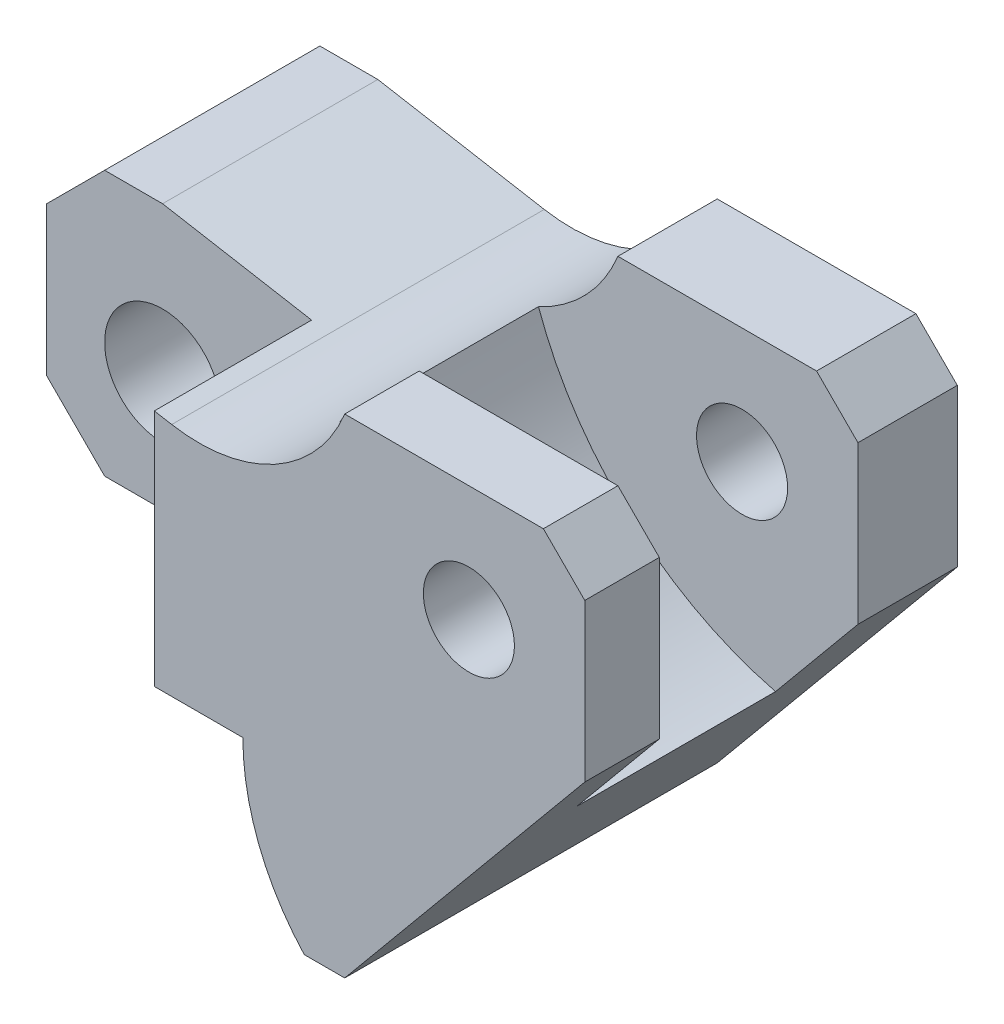
ISO-10303-21;
HEADER;
FILE_DESCRIPTION(('STEP AP214'),'2;1');
FILE_NAME('part.step','',(''),(''),'','','');
FILE_SCHEMA(('AUTOMOTIVE_DESIGN { 1 0 10303 214 1 1 1 1 }'));
ENDSEC;
DATA;
#1=APPLICATION_CONTEXT('core data for automotive mechanical design processes');
#2=APPLICATION_PROTOCOL_DEFINITION('international standard','automotive_design',2000,#1);
#3=PRODUCT_CONTEXT('',#1,'mechanical');
#4=PRODUCT('Part','Part','',(#3));
#5=PRODUCT_RELATED_PRODUCT_CATEGORY('part','',(#4));
#6=PRODUCT_DEFINITION_FORMATION('','',#4);
#7=PRODUCT_DEFINITION_CONTEXT('part definition',#1,'design');
#8=PRODUCT_DEFINITION('design','',#6,#7);
#9=PRODUCT_DEFINITION_SHAPE('','',#8);
#10=(LENGTH_UNIT() NAMED_UNIT(*) SI_UNIT(.MILLI.,.METRE.));
#11=(NAMED_UNIT(*) PLANE_ANGLE_UNIT() SI_UNIT($,.RADIAN.));
#12=(NAMED_UNIT(*) SI_UNIT($,.STERADIAN.) SOLID_ANGLE_UNIT());
#13=UNCERTAINTY_MEASURE_WITH_UNIT(LENGTH_MEASURE(1.E-05),#10,'distance_accuracy_value','');
#14=(GEOMETRIC_REPRESENTATION_CONTEXT(3) GLOBAL_UNCERTAINTY_ASSIGNED_CONTEXT((#13)) GLOBAL_UNIT_ASSIGNED_CONTEXT((#10,
#11,#12)) REPRESENTATION_CONTEXT('',''));
#15=CARTESIAN_POINT('',(0.,0.,0.));
#16=DIRECTION('',(0.,0.,1.));
#17=DIRECTION('',(1.,0.,0.));
#18=AXIS2_PLACEMENT_3D('',#15,#16,#17);
#19=CARTESIAN_POINT('',(52.,35.,0.));
#20=DIRECTION('',(0.707106781186544,0.707106781186551,0.));
#21=DIRECTION('',(0.,0.,-1.));
#22=AXIS2_PLACEMENT_3D('',#19,#20,#21);
#23=PLANE('',#22);
#24=DIRECTION('',(0.,0.,-1.));
#25=VECTOR('',#24,1.);
#26=CARTESIAN_POINT('',(47.,40.,0.));
#27=LINE('',#26,#25);
#28=CARTESIAN_POINT('',(47.,40.,12.));
#29=VERTEX_POINT('',#28);
#30=CARTESIAN_POINT('',(47.,40.,0.));
#31=VERTEX_POINT('',#30);
#32=EDGE_CURVE('E304',#29,#31,#27,.T.);
#33=ORIENTED_EDGE('',*,*,#32,.F.);
#34=DIRECTION('',(0.707106781186551,-0.707106781186544,0.));
#35=VECTOR('',#34,1.);
#36=CARTESIAN_POINT('',(52.,35.,12.));
#37=LINE('',#36,#35);
#38=CARTESIAN_POINT('',(52.,35.,12.));
#39=VERTEX_POINT('',#38);
#40=EDGE_CURVE('E352',#29,#39,#37,.T.);
#41=ORIENTED_EDGE('',*,*,#40,.T.);
#42=DIRECTION('',(0.,0.,1.));
#43=VECTOR('',#42,1.);
#44=CARTESIAN_POINT('',(52.,35.,45.));
#45=LINE('',#44,#43);
#46=CARTESIAN_POINT('',(52.,35.,0.));
#47=VERTEX_POINT('',#46);
#48=EDGE_CURVE('E299',#47,#39,#45,.T.);
#49=ORIENTED_EDGE('',*,*,#48,.F.);
#50=DIRECTION('',(0.707106781186551,-0.707106781186544,0.));
#51=VECTOR('',#50,1.);
#52=CARTESIAN_POINT('',(27.4999999999996,59.5000000000002,0.));
#53=LINE('',#52,#51);
#54=EDGE_CURVE('E308',#31,#47,#53,.T.);
#55=ORIENTED_EDGE('',*,*,#54,.F.);
#56=EDGE_LOOP('',(#33,#41,#49,#55));
#57=FACE_BOUND('',#56,.T.);
#58=ADVANCED_FACE('F39',(#57),#23,.T.);
#59=CARTESIAN_POINT('',(52.,40.,0.));
#60=DIRECTION('',(0.,-1.,0.));
#61=DIRECTION('',(0.,0.,-1.));
#62=AXIS2_PLACEMENT_3D('',#59,#60,#61);
#63=PLANE('',#62);
#64=DIRECTION('',(-1.,0.,0.));
#65=VECTOR('',#64,1.);
#66=CARTESIAN_POINT('',(52.,40.,12.));
#67=LINE('',#66,#65);
#68=CARTESIAN_POINT('',(23.,40.,12.));
#69=VERTEX_POINT('',#68);
#70=EDGE_CURVE('E191',#29,#69,#67,.T.);
#71=ORIENTED_EDGE('',*,*,#70,.F.);
#72=ORIENTED_EDGE('',*,*,#32,.T.);
#73=DIRECTION('',(-1.,0.,0.));
#74=VECTOR('',#73,1.);
#75=CARTESIAN_POINT('',(52.,40.,0.));
#76=LINE('',#75,#74);
#77=CARTESIAN_POINT('',(23.,40.,0.));
#78=VERTEX_POINT('',#77);
#79=EDGE_CURVE('E251',#31,#78,#76,.T.);
#80=ORIENTED_EDGE('',*,*,#79,.T.);
#81=DIRECTION('',(0.,0.,1.));
#82=VECTOR('',#81,1.);
#83=CARTESIAN_POINT('',(23.,40.,-0.0100000000000046));
#84=LINE('',#83,#82);
#85=EDGE_CURVE('E312',#78,#69,#84,.T.);
#86=ORIENTED_EDGE('',*,*,#85,.T.);
#87=EDGE_LOOP('',(#71,#72,#80,#86));
#88=FACE_BOUND('',#87,.T.);
#89=ADVANCED_FACE('F380',(#88),#63,.F.);
#90=CARTESIAN_POINT('',(52.,0.,0.));
#91=DIRECTION('',(1.,0.,0.));
#92=DIRECTION('',(0.,0.,-1.));
#93=AXIS2_PLACEMENT_3D('',#90,#91,#92);
#94=PLANE('',#93);
#95=ORIENTED_EDGE('',*,*,#48,.T.);
#96=DIRECTION('',(0.,-1.,0.));
#97=VECTOR('',#96,1.);
#98=CARTESIAN_POINT('',(52.,0.,12.));
#99=LINE('',#98,#97);
#100=CARTESIAN_POINT('',(52.,16.,12.));
#101=VERTEX_POINT('',#100);
#102=EDGE_CURVE('E346',#39,#101,#99,.T.);
#103=ORIENTED_EDGE('',*,*,#102,.T.);
#104=DIRECTION('',(0.,0.,1.));
#105=VECTOR('',#104,1.);
#106=CARTESIAN_POINT('',(52.,16.,0.));
#107=LINE('',#106,#105);
#108=CARTESIAN_POINT('',(52.,16.,0.));
#109=VERTEX_POINT('',#108);
#110=EDGE_CURVE('E341',#109,#101,#107,.T.);
#111=ORIENTED_EDGE('',*,*,#110,.F.);
#112=DIRECTION('',(0.,1.,0.));
#113=VECTOR('',#112,1.);
#114=CARTESIAN_POINT('',(52.,0.,0.));
#115=LINE('',#114,#113);
#116=EDGE_CURVE('E245',#109,#47,#115,.T.);
#117=ORIENTED_EDGE('',*,*,#116,.T.);
#118=EDGE_LOOP('',(#95,#103,#111,#117));
#119=FACE_BOUND('',#118,.T.);
#120=ADVANCED_FACE('F349',(#119),#94,.T.);
#121=CARTESIAN_POINT('',(52.,-19.,0.));
#122=DIRECTION('',(0.,-1.,0.));
#123=DIRECTION('',(0.,0.,-1.));
#124=AXIS2_PLACEMENT_3D('',#121,#122,#123);
#125=PLANE('',#124);
#126=DIRECTION('',(-1.,0.,0.));
#127=VECTOR('',#126,1.);
#128=CARTESIAN_POINT('',(52.,-19.,45.));
#129=LINE('',#128,#127);
#130=CARTESIAN_POINT('',(23.,-19.,45.));
#131=VERTEX_POINT('',#130);
#132=CARTESIAN_POINT('',(18.1134654255188,-19.,45.));
#133=VERTEX_POINT('',#132);
#134=EDGE_CURVE('E257',#131,#133,#129,.T.);
#135=ORIENTED_EDGE('',*,*,#134,.T.);
#136=DIRECTION('',(0.,0.,1.));
#137=VECTOR('',#136,1.);
#138=CARTESIAN_POINT('',(18.1134654255188,-19.,0.));
#139=LINE('',#138,#137);
#140=CARTESIAN_POINT('',(18.1134654255188,-19.,0.));
#141=VERTEX_POINT('',#140);
#142=EDGE_CURVE('E223',#141,#133,#139,.T.);
#143=ORIENTED_EDGE('',*,*,#142,.F.);
#144=DIRECTION('',(-1.,0.,0.));
#145=VECTOR('',#144,1.);
#146=CARTESIAN_POINT('',(52.,-19.,0.));
#147=LINE('',#146,#145);
#148=CARTESIAN_POINT('',(23.,-19.,0.));
#149=VERTEX_POINT('',#148);
#150=EDGE_CURVE('E254',#149,#141,#147,.T.);
#151=ORIENTED_EDGE('',*,*,#150,.F.);
#152=DIRECTION('',(0.,0.,1.));
#153=VECTOR('',#152,1.);
#154=CARTESIAN_POINT('',(23.,-19.,-7.00000000000001));
#155=LINE('',#154,#153);
#156=EDGE_CURVE('E231',#149,#131,#155,.T.);
#157=ORIENTED_EDGE('',*,*,#156,.T.);
#158=EDGE_LOOP('',(#135,#143,#151,#157));
#159=FACE_BOUND('',#158,.T.);
#160=ADVANCED_FACE('F496',(#159),#125,.T.);
#161=CARTESIAN_POINT('',(52.,0.,45.));
#162=DIRECTION('',(0.,0.,1.));
#163=DIRECTION('',(1.,0.,0.));
#164=AXIS2_PLACEMENT_3D('',#161,#162,#163);
#165=PLANE('',#164);
#166=CARTESIAN_POINT('',(38.,26.,45.));
#167=DIRECTION('',(0.,0.,1.));
#168=DIRECTION('',(1.,0.,0.));
#169=AXIS2_PLACEMENT_3D('',#166,#167,#168);
#170=CIRCLE('',#169,5.5);
#171=CARTESIAN_POINT('',(43.5,26.,45.));
#172=VERTEX_POINT('',#171);
#173=EDGE_CURVE('E433',#172,#172,#170,.T.);
#174=ORIENTED_EDGE('',*,*,#173,.F.);
#175=EDGE_LOOP('',(#174));
#176=FACE_BOUND('',#175,.T.);
#177=DIRECTION('',(0.984807753012208,-0.173648177666931,0.));
#178=VECTOR('',#177,1.);
#179=CARTESIAN_POINT('',(55.3615640207175,19.0643769161761,45.));
#180=LINE('',#179,#178);
#181=CARTESIAN_POINT('',(0.,28.8261143472476,45.));
#182=VERTEX_POINT('',#181);
#183=CARTESIAN_POINT('',(2.10404235201317,28.4551149120344,45.));
#184=VERTEX_POINT('',#183);
#185=EDGE_CURVE('E315',#182,#184,#180,.T.);
#186=ORIENTED_EDGE('',*,*,#185,.F.);
#187=DIRECTION('',(0.,1.,0.));
#188=VECTOR('',#187,1.);
#189=CARTESIAN_POINT('',(0.,0.,45.));
#190=LINE('',#189,#188);
#191=CARTESIAN_POINT('',(0.,0.,45.));
#192=VERTEX_POINT('',#191);
#193=EDGE_CURVE('E239',#192,#182,#190,.T.);
#194=ORIENTED_EDGE('',*,*,#193,.F.);
#195=DIRECTION('',(-1.,0.,0.));
#196=VECTOR('',#195,1.);
#197=CARTESIAN_POINT('',(0.,0.,45.));
#198=LINE('',#197,#196);
#199=CARTESIAN_POINT('',(10.6969696969697,-1.89158424479087E-13,45.));
#200=VERTEX_POINT('',#199);
#201=EDGE_CURVE('E213',#200,#192,#198,.T.);
#202=ORIENTED_EDGE('',*,*,#201,.F.);
#203=CARTESIAN_POINT('',(38.7428571428571,0.,45.));
#204=DIRECTION('',(0.,0.,1.));
#205=DIRECTION('',(1.,0.,0.));
#206=AXIS2_PLACEMENT_3D('',#203,#204,#205);
#207=CIRCLE('',#206,28.0458874458874);
#208=EDGE_CURVE('E210',#200,#133,#207,.T.);
#209=ORIENTED_EDGE('',*,*,#208,.T.);
#210=ORIENTED_EDGE('',*,*,#134,.F.);
#211=DIRECTION('',(-0.638017864750323,-0.770021560905562,0.));
#212=VECTOR('',#211,1.);
#213=CARTESIAN_POINT('',(52.,16.,45.));
#214=LINE('',#213,#212);
#215=CARTESIAN_POINT('',(52.,16.,45.));
#216=VERTEX_POINT('',#215);
#217=EDGE_CURVE('E225',#216,#131,#214,.T.);
#218=ORIENTED_EDGE('',*,*,#217,.F.);
#219=DIRECTION('',(0.,1.,0.));
#220=VECTOR('',#219,1.);
#221=CARTESIAN_POINT('',(52.,0.,45.));
#222=LINE('',#221,#220);
#223=CARTESIAN_POINT('',(52.,35.,45.));
#224=VERTEX_POINT('',#223);
#225=EDGE_CURVE('E242',#216,#224,#222,.T.);
#226=ORIENTED_EDGE('',*,*,#225,.T.);
#227=DIRECTION('',(-0.707106781186551,0.707106781186544,0.));
#228=VECTOR('',#227,1.);
#229=CARTESIAN_POINT('',(69.5,17.5000000000002,45.));
#230=LINE('',#229,#228);
#231=CARTESIAN_POINT('',(47.,40.,45.));
#232=VERTEX_POINT('',#231);
#233=EDGE_CURVE('E302',#224,#232,#230,.T.);
#234=ORIENTED_EDGE('',*,*,#233,.T.);
#235=DIRECTION('',(-1.,0.,0.));
#236=VECTOR('',#235,1.);
#237=CARTESIAN_POINT('',(52.,40.,45.));
#238=LINE('',#237,#236);
#239=CARTESIAN_POINT('',(23.,40.,45.));
#240=VERTEX_POINT('',#239);
#241=EDGE_CURVE('E247',#232,#240,#238,.T.);
#242=ORIENTED_EDGE('',*,*,#241,.T.);
#243=CARTESIAN_POINT('',(5.40335772768485,47.1664622192663,45.));
#244=DIRECTION('',(0.,0.,1.));
#245=DIRECTION('',(1.,0.,0.));
#246=AXIS2_PLACEMENT_3D('',#243,#244,#245);
#247=CIRCLE('',#246,19.);
#248=EDGE_CURVE('E319',#184,#240,#247,.T.);
#249=ORIENTED_EDGE('',*,*,#248,.F.);
#250=EDGE_LOOP('',(#186,#194,#202,#209,#210,#218,#226,#234,#242,#249));
#251=FACE_BOUND('',#250,.T.);
#252=ADVANCED_FACE('F420',(#176,#251),#165,.T.);
#253=CARTESIAN_POINT('',(-32.,0.,0.));
#254=DIRECTION('',(0.,0.,-1.));
#255=DIRECTION('',(0.,1.,0.));
#256=AXIS2_PLACEMENT_3D('',#253,#254,#255);
#257=PLANE('',#256);
#258=CARTESIAN_POINT('',(38.,26.,0.));
#259=DIRECTION('',(0.,0.,1.));
#260=DIRECTION('',(1.,0.,0.));
#261=AXIS2_PLACEMENT_3D('',#258,#259,#260);
#262=CIRCLE('',#261,5.5);
#263=CARTESIAN_POINT('',(43.5,26.,0.));
#264=VERTEX_POINT('',#263);
#265=EDGE_CURVE('E436',#264,#264,#262,.T.);
#266=ORIENTED_EDGE('',*,*,#265,.T.);
#267=EDGE_LOOP('',(#266));
#268=FACE_BOUND('',#267,.T.);
#269=CARTESIAN_POINT('',(-18.,14.,0.));
#270=DIRECTION('',(0.,0.,1.));
#271=DIRECTION('',(1.,0.,0.));
#272=AXIS2_PLACEMENT_3D('',#269,#270,#271);
#273=CIRCLE('',#272,7.);
#274=CARTESIAN_POINT('',(-11.,14.,0.));
#275=VERTEX_POINT('',#274);
#276=EDGE_CURVE('E236',#275,#275,#273,.T.);
#277=ORIENTED_EDGE('',*,*,#276,.T.);
#278=EDGE_LOOP('',(#277));
#279=FACE_BOUND('',#278,.T.);
#280=CARTESIAN_POINT('',(5.40335772768485,47.1664622192663,0.));
#281=DIRECTION('',(0.,0.,-1.));
#282=DIRECTION('',(0.,1.,0.));
#283=AXIS2_PLACEMENT_3D('',#280,#281,#282);
#284=CIRCLE('',#283,19.);
#285=CARTESIAN_POINT('',(2.10404235201317,28.4551149120344,0.));
#286=VERTEX_POINT('',#285);
#287=EDGE_CURVE('E328',#78,#286,#284,.T.);
#288=ORIENTED_EDGE('',*,*,#287,.F.);
#289=ORIENTED_EDGE('',*,*,#79,.F.);
#290=ORIENTED_EDGE('',*,*,#54,.T.);
#291=ORIENTED_EDGE('',*,*,#116,.F.);
#292=DIRECTION('',(0.638017864750323,0.770021560905562,0.));
#293=VECTOR('',#292,1.);
#294=CARTESIAN_POINT('',(9.94578896418197,-34.7550822846079,0.));
#295=LINE('',#294,#293);
#296=EDGE_CURVE('E63',#149,#109,#295,.T.);
#297=ORIENTED_EDGE('',*,*,#296,.F.);
#298=ORIENTED_EDGE('',*,*,#150,.T.);
#299=CARTESIAN_POINT('',(38.7428571428571,0.,0.));
#300=DIRECTION('',(0.,0.,1.));
#301=DIRECTION('',(1.,0.,0.));
#302=AXIS2_PLACEMENT_3D('',#299,#300,#301);
#303=CIRCLE('',#302,28.0458874458874);
#304=CARTESIAN_POINT('',(10.6969696969697,-1.89158424479087E-13,0.));
#305=VERTEX_POINT('',#304);
#306=EDGE_CURVE('E219',#305,#141,#303,.T.);
#307=ORIENTED_EDGE('',*,*,#306,.F.);
#308=DIRECTION('',(1.,0.,0.));
#309=VECTOR('',#308,1.);
#310=CARTESIAN_POINT('',(-32.,0.,0.));
#311=LINE('',#310,#309);
#312=CARTESIAN_POINT('',(-25.,0.,0.));
#313=VERTEX_POINT('',#312);
#314=EDGE_CURVE('E274',#313,#305,#311,.T.);
#315=ORIENTED_EDGE('',*,*,#314,.F.);
#316=DIRECTION('',(-0.707106781186548,0.707106781186547,0.));
#317=VECTOR('',#316,1.);
#318=CARTESIAN_POINT('',(-28.5,3.5,0.));
#319=LINE('',#318,#317);
#320=CARTESIAN_POINT('',(-32.,6.99999999999999,0.));
#321=VERTEX_POINT('',#320);
#322=EDGE_CURVE('E293',#313,#321,#319,.T.);
#323=ORIENTED_EDGE('',*,*,#322,.T.);
#324=DIRECTION('',(0.,1.,0.));
#325=VECTOR('',#324,1.);
#326=CARTESIAN_POINT('',(-32.,0.,0.));
#327=LINE('',#326,#325);
#328=CARTESIAN_POINT('',(-32.,25.,0.));
#329=VERTEX_POINT('',#328);
#330=EDGE_CURVE('E264',#321,#329,#327,.T.);
#331=ORIENTED_EDGE('',*,*,#330,.T.);
#332=DIRECTION('',(-0.707106781186546,-0.707106781186549,0.));
#333=VECTOR('',#332,1.);
#334=CARTESIAN_POINT('',(-44.5,12.4999999999999,0.));
#335=LINE('',#334,#333);
#336=CARTESIAN_POINT('',(-25.,32.,0.));
#337=VERTEX_POINT('',#336);
#338=EDGE_CURVE('E291',#329,#337,#335,.F.);
#339=ORIENTED_EDGE('',*,*,#338,.T.);
#340=DIRECTION('',(1.,0.,0.));
#341=VECTOR('',#340,1.);
#342=CARTESIAN_POINT('',(-32.,32.,0.));
#343=LINE('',#342,#341);
#344=CARTESIAN_POINT('',(-18.0000000000002,32.,0.));
#345=VERTEX_POINT('',#344);
#346=EDGE_CURVE('E270',#337,#345,#343,.T.);
#347=ORIENTED_EDGE('',*,*,#346,.T.);
#348=DIRECTION('',(-0.984807753012208,0.173648177666931,0.));
#349=VECTOR('',#348,1.);
#350=CARTESIAN_POINT('',(-26.1055260522906,33.4292229358542,0.));
#351=LINE('',#350,#349);
#352=EDGE_CURVE('E322',#286,#345,#351,.T.);
#353=ORIENTED_EDGE('',*,*,#352,.F.);
#354=EDGE_LOOP('',(#288,#289,#290,#291,#297,#298,#307,#315,#323,#331,#339,#347,#353));
#355=FACE_BOUND('',#354,.T.);
#356=ADVANCED_FACE('F503',(#268,#279,#355),#257,.T.);
#357=CARTESIAN_POINT('',(5.40335772768485,47.1664622192663,-0.0100000000000035));
#358=DIRECTION('',(0.,0.,1.));
#359=DIRECTION('',(1.,0.,0.));
#360=AXIS2_PLACEMENT_3D('',#357,#358,#359);
#361=CYLINDRICAL_SURFACE('',#360,19.);
#362=CARTESIAN_POINT('',(23.,40.,36.));
#363=VERTEX_POINT('',#362);
#364=EDGE_CURVE('E311',#363,#240,#84,.T.);
#365=ORIENTED_EDGE('',*,*,#364,.F.);
#366=CARTESIAN_POINT('',(5.40335772768485,47.1664622192663,36.));
#367=DIRECTION('',(0.,0.,1.));
#368=DIRECTION('',(1.,0.,0.));
#369=AXIS2_PLACEMENT_3D('',#366,#367,#368);
#370=CIRCLE('',#369,19.);
#371=CARTESIAN_POINT('',(13.4017825039806,29.9320431371523,36.));
#372=VERTEX_POINT('',#371);
#373=EDGE_CURVE('E209',#363,#372,#370,.F.);
#374=ORIENTED_EDGE('',*,*,#373,.T.);
#375=DIRECTION('',(0.,0.,-1.));
#376=VECTOR('',#375,1.);
#377=CARTESIAN_POINT('',(13.4017825039806,29.9320431371523,24.));
#378=LINE('',#377,#376);
#379=CARTESIAN_POINT('',(13.4017825039806,29.9320431371523,12.));
#380=VERTEX_POINT('',#379);
#381=EDGE_CURVE('E200',#380,#372,#378,.F.);
#382=ORIENTED_EDGE('',*,*,#381,.F.);
#383=CARTESIAN_POINT('',(5.40335772768485,47.1664622192663,12.));
#384=DIRECTION('',(0.,0.,1.));
#385=DIRECTION('',(1.,0.,0.));
#386=AXIS2_PLACEMENT_3D('',#383,#384,#385);
#387=CIRCLE('',#386,19.);
#388=EDGE_CURVE('E188',#69,#380,#387,.F.);
#389=ORIENTED_EDGE('',*,*,#388,.F.);
#390=ORIENTED_EDGE('',*,*,#85,.F.);
#391=ORIENTED_EDGE('',*,*,#287,.T.);
#392=DIRECTION('',(0.,0.,1.));
#393=VECTOR('',#392,1.);
#394=CARTESIAN_POINT('',(2.10404235201317,28.4551149120344,-0.0100000000000035));
#395=LINE('',#394,#393);
#396=EDGE_CURVE('E318',#286,#184,#395,.T.);
#397=ORIENTED_EDGE('',*,*,#396,.T.);
#398=ORIENTED_EDGE('',*,*,#248,.T.);
#399=EDGE_LOOP('',(#365,#374,#382,#389,#390,#391,#397,#398));
#400=FACE_BOUND('',#399,.T.);
#401=ADVANCED_FACE('F41',(#400),#361,.F.);
#402=CARTESIAN_POINT('',(-18.,32.,-0.0100000000000035));
#403=DIRECTION('',(-0.173648177666931,-0.984807753012208,0.));
#404=DIRECTION('',(0.984807753012208,-0.173648177666931,0.));
#405=AXIS2_PLACEMENT_3D('',#402,#403,#404);
#406=PLANE('',#405);
#407=ORIENTED_EDGE('',*,*,#352,.T.);
#408=DIRECTION('',(0.,0.,1.));
#409=VECTOR('',#408,1.);
#410=CARTESIAN_POINT('',(-18.0000000000002,32.,0.));
#411=LINE('',#410,#409);
#412=CARTESIAN_POINT('',(-18.0000000000001,32.,26.));
#413=VERTEX_POINT('',#412);
#414=EDGE_CURVE('E325',#345,#413,#411,.T.);
#415=ORIENTED_EDGE('',*,*,#414,.T.);
#416=DIRECTION('',(-0.984807753012208,0.173648177666931,0.));
#417=VECTOR('',#416,1.);
#418=CARTESIAN_POINT('',(-26.1055260522906,33.4292229358542,26.));
#419=LINE('',#418,#417);
#420=CARTESIAN_POINT('',(0.,28.8261143472476,26.));
#421=VERTEX_POINT('',#420);
#422=EDGE_CURVE('E335',#421,#413,#419,.T.);
#423=ORIENTED_EDGE('',*,*,#422,.F.);
#424=DIRECTION('',(0.,0.,-1.));
#425=VECTOR('',#424,1.);
#426=CARTESIAN_POINT('',(0.,28.8261143472476,0.));
#427=LINE('',#426,#425);
#428=EDGE_CURVE('E324',#182,#421,#427,.T.);
#429=ORIENTED_EDGE('',*,*,#428,.F.);
#430=ORIENTED_EDGE('',*,*,#185,.T.);
#431=ORIENTED_EDGE('',*,*,#396,.F.);
#432=EDGE_LOOP('',(#407,#415,#423,#429,#430,#431));
#433=FACE_BOUND('',#432,.T.);
#434=ADVANCED_FACE('F371',(#433),#406,.F.);
#435=CARTESIAN_POINT('',(-18.,14.,0.));
#436=DIRECTION('',(0.,0.,1.));
#437=DIRECTION('',(1.,0.,0.));
#438=AXIS2_PLACEMENT_3D('',#435,#436,#437);
#439=CYLINDRICAL_SURFACE('',#438,7.);
#440=ORIENTED_EDGE('',*,*,#276,.F.);
#441=EDGE_LOOP('',(#440));
#442=FACE_BOUND('',#441,.T.);
#443=CARTESIAN_POINT('',(-18.,14.,26.));
#444=DIRECTION('',(0.,0.,1.));
#445=DIRECTION('',(1.,0.,0.));
#446=AXIS2_PLACEMENT_3D('',#443,#444,#445);
#447=CIRCLE('',#446,7.);
#448=CARTESIAN_POINT('',(-11.,14.,26.));
#449=VERTEX_POINT('',#448);
#450=EDGE_CURVE('E235',#449,#449,#447,.T.);
#451=ORIENTED_EDGE('',*,*,#450,.T.);
#452=EDGE_LOOP('',(#451));
#453=FACE_BOUND('',#452,.T.);
#454=ADVANCED_FACE('F378',(#442,#453),#439,.F.);
#455=CARTESIAN_POINT('',(0.,0.,0.));
#456=DIRECTION('',(1.,0.,0.));
#457=DIRECTION('',(0.,0.,-1.));
#458=AXIS2_PLACEMENT_3D('',#455,#456,#457);
#459=PLANE('',#458);
#460=DIRECTION('',(0.,1.,0.));
#461=VECTOR('',#460,1.);
#462=CARTESIAN_POINT('',(0.,0.,26.));
#463=LINE('',#462,#461);
#464=CARTESIAN_POINT('',(0.,0.,26.));
#465=VERTEX_POINT('',#464);
#466=EDGE_CURVE('E260',#465,#421,#463,.T.);
#467=ORIENTED_EDGE('',*,*,#466,.F.);
#468=DIRECTION('',(0.,0.,1.));
#469=VECTOR('',#468,1.);
#470=CARTESIAN_POINT('',(0.,0.,0.));
#471=LINE('',#470,#469);
#472=EDGE_CURVE('E226',#465,#192,#471,.T.);
#473=ORIENTED_EDGE('',*,*,#472,.T.);
#474=ORIENTED_EDGE('',*,*,#193,.T.);
#475=ORIENTED_EDGE('',*,*,#428,.T.);
#476=EDGE_LOOP('',(#467,#473,#474,#475));
#477=FACE_BOUND('',#476,.T.);
#478=ADVANCED_FACE('F394',(#477),#459,.F.);
#479=DIRECTION('',(0.707106781186551,-0.707106781186544,0.));
#480=VECTOR('',#479,1.);
#481=CARTESIAN_POINT('',(52.,35.,36.));
#482=LINE('',#481,#480);
#483=CARTESIAN_POINT('',(47.,40.,36.));
#484=VERTEX_POINT('',#483);
#485=CARTESIAN_POINT('',(52.,35.,36.));
#486=VERTEX_POINT('',#485);
#487=EDGE_CURVE('E410',#484,#486,#482,.T.);
#488=ORIENTED_EDGE('',*,*,#487,.F.);
#489=EDGE_CURVE('E305',#232,#484,#27,.T.);
#490=ORIENTED_EDGE('',*,*,#489,.F.);
#491=ORIENTED_EDGE('',*,*,#233,.F.);
#492=EDGE_CURVE('E298',#486,#224,#45,.T.);
#493=ORIENTED_EDGE('',*,*,#492,.F.);
#494=EDGE_LOOP('',(#488,#490,#491,#493));
#495=FACE_BOUND('',#494,.T.);
#496=ADVANCED_FACE('F383',(#495),#23,.T.);
#497=CARTESIAN_POINT('',(-32.,0.,26.));
#498=DIRECTION('',(0.,0.,-1.));
#499=DIRECTION('',(-1.,0.,0.));
#500=AXIS2_PLACEMENT_3D('',#497,#498,#499);
#501=PLANE('',#500);
#502=ORIENTED_EDGE('',*,*,#450,.F.);
#503=EDGE_LOOP('',(#502));
#504=FACE_BOUND('',#503,.T.);
#505=ORIENTED_EDGE('',*,*,#466,.T.);
#506=ORIENTED_EDGE('',*,*,#422,.T.);
#507=DIRECTION('',(1.,0.,0.));
#508=VECTOR('',#507,1.);
#509=CARTESIAN_POINT('',(-32.,32.,26.));
#510=LINE('',#509,#508);
#511=CARTESIAN_POINT('',(-25.,32.,26.));
#512=VERTEX_POINT('',#511);
#513=EDGE_CURVE('E267',#512,#413,#510,.T.);
#514=ORIENTED_EDGE('',*,*,#513,.F.);
#515=DIRECTION('',(0.707106781186546,0.707106781186549,0.));
#516=VECTOR('',#515,1.);
#517=CARTESIAN_POINT('',(-25.,32.,26.));
#518=LINE('',#517,#516);
#519=CARTESIAN_POINT('',(-32.,25.,26.));
#520=VERTEX_POINT('',#519);
#521=EDGE_CURVE('E285',#512,#520,#518,.F.);
#522=ORIENTED_EDGE('',*,*,#521,.T.);
#523=DIRECTION('',(0.,1.,0.));
#524=VECTOR('',#523,1.);
#525=CARTESIAN_POINT('',(-32.,0.,26.));
#526=LINE('',#525,#524);
#527=CARTESIAN_POINT('',(-32.,6.99999999999999,26.));
#528=VERTEX_POINT('',#527);
#529=EDGE_CURVE('E261',#528,#520,#526,.T.);
#530=ORIENTED_EDGE('',*,*,#529,.F.);
#531=DIRECTION('',(0.707106781186548,-0.707106781186547,0.));
#532=VECTOR('',#531,1.);
#533=CARTESIAN_POINT('',(-32.,6.99999999999999,26.));
#534=LINE('',#533,#532);
#535=CARTESIAN_POINT('',(-25.,0.,26.));
#536=VERTEX_POINT('',#535);
#537=EDGE_CURVE('E287',#528,#536,#534,.T.);
#538=ORIENTED_EDGE('',*,*,#537,.T.);
#539=DIRECTION('',(1.,0.,0.));
#540=VECTOR('',#539,1.);
#541=CARTESIAN_POINT('',(-32.,0.,26.));
#542=LINE('',#541,#540);
#543=EDGE_CURVE('E276',#536,#465,#542,.T.);
#544=ORIENTED_EDGE('',*,*,#543,.T.);
#545=EDGE_LOOP('',(#505,#506,#514,#522,#530,#538,#544));
#546=FACE_BOUND('',#545,.T.);
#547=ADVANCED_FACE('F393',(#504,#546),#501,.F.);
#548=CARTESIAN_POINT('',(-25.,32.,0.));
#549=DIRECTION('',(0.707106781186549,-0.707106781186546,0.));
#550=DIRECTION('',(0.,0.,1.));
#551=AXIS2_PLACEMENT_3D('',#548,#549,#550);
#552=PLANE('',#551);
#553=ORIENTED_EDGE('',*,*,#338,.F.);
#554=DIRECTION('',(0.,0.,-1.));
#555=VECTOR('',#554,1.);
#556=CARTESIAN_POINT('',(-32.,25.,0.));
#557=LINE('',#556,#555);
#558=EDGE_CURVE('E273',#520,#329,#557,.T.);
#559=ORIENTED_EDGE('',*,*,#558,.F.);
#560=ORIENTED_EDGE('',*,*,#521,.F.);
#561=DIRECTION('',(0.,0.,1.));
#562=VECTOR('',#561,1.);
#563=CARTESIAN_POINT('',(-25.,32.,0.));
#564=LINE('',#563,#562);
#565=EDGE_CURVE('E295',#337,#512,#564,.T.);
#566=ORIENTED_EDGE('',*,*,#565,.F.);
#567=EDGE_LOOP('',(#553,#559,#560,#566));
#568=FACE_BOUND('',#567,.T.);
#569=ADVANCED_FACE('F401',(#568),#552,.F.);
#570=CARTESIAN_POINT('',(-32.,6.99999999999999,0.));
#571=DIRECTION('',(-0.707106781186547,-0.707106781186548,0.));
#572=DIRECTION('',(0.,0.,-1.));
#573=AXIS2_PLACEMENT_3D('',#570,#571,#572);
#574=PLANE('',#573);
#575=ORIENTED_EDGE('',*,*,#322,.F.);
#576=DIRECTION('',(0.,0.,-1.));
#577=VECTOR('',#576,1.);
#578=CARTESIAN_POINT('',(-25.,0.,0.));
#579=LINE('',#578,#577);
#580=EDGE_CURVE('E289',#536,#313,#579,.T.);
#581=ORIENTED_EDGE('',*,*,#580,.F.);
#582=ORIENTED_EDGE('',*,*,#537,.F.);
#583=DIRECTION('',(0.,0.,1.));
#584=VECTOR('',#583,1.);
#585=CARTESIAN_POINT('',(-32.,6.99999999999999,26.));
#586=LINE('',#585,#584);
#587=EDGE_CURVE('E282',#321,#528,#586,.T.);
#588=ORIENTED_EDGE('',*,*,#587,.F.);
#589=EDGE_LOOP('',(#575,#581,#582,#588));
#590=FACE_BOUND('',#589,.T.);
#591=ADVANCED_FACE('F525',(#590),#574,.T.);
#592=ORIENTED_EDGE('',*,*,#489,.T.);
#593=DIRECTION('',(-1.,0.,0.));
#594=VECTOR('',#593,1.);
#595=CARTESIAN_POINT('',(52.,40.,36.));
#596=LINE('',#595,#594);
#597=EDGE_CURVE('E215',#484,#363,#596,.T.);
#598=ORIENTED_EDGE('',*,*,#597,.T.);
#599=ORIENTED_EDGE('',*,*,#364,.T.);
#600=ORIENTED_EDGE('',*,*,#241,.F.);
#601=EDGE_LOOP('',(#592,#598,#599,#600));
#602=FACE_BOUND('',#601,.T.);
#603=ADVANCED_FACE('F375',(#602),#63,.F.);
#604=CARTESIAN_POINT('',(-32.,32.,0.));
#605=DIRECTION('',(0.,1.,0.));
#606=DIRECTION('',(0.,0.,1.));
#607=AXIS2_PLACEMENT_3D('',#604,#605,#606);
#608=PLANE('',#607);
#609=ORIENTED_EDGE('',*,*,#414,.F.);
#610=ORIENTED_EDGE('',*,*,#346,.F.);
#611=ORIENTED_EDGE('',*,*,#565,.T.);
#612=ORIENTED_EDGE('',*,*,#513,.T.);
#613=EDGE_LOOP('',(#609,#610,#611,#612));
#614=FACE_BOUND('',#613,.T.);
#615=ADVANCED_FACE('F359',(#614),#608,.T.);
#616=CARTESIAN_POINT('',(-32.,0.,0.));
#617=DIRECTION('',(0.,1.,0.));
#618=DIRECTION('',(0.,0.,1.));
#619=AXIS2_PLACEMENT_3D('',#616,#617,#618);
#620=PLANE('',#619);
#621=ORIENTED_EDGE('',*,*,#543,.F.);
#622=ORIENTED_EDGE('',*,*,#580,.T.);
#623=ORIENTED_EDGE('',*,*,#314,.T.);
#624=DIRECTION('',(0.,0.,1.));
#625=VECTOR('',#624,1.);
#626=CARTESIAN_POINT('',(10.6969696969697,-1.89158424479087E-13,0.));
#627=LINE('',#626,#625);
#628=EDGE_CURVE('E220',#305,#200,#627,.T.);
#629=ORIENTED_EDGE('',*,*,#628,.T.);
#630=ORIENTED_EDGE('',*,*,#201,.T.);
#631=ORIENTED_EDGE('',*,*,#472,.F.);
#632=EDGE_LOOP('',(#621,#622,#623,#629,#630,#631));
#633=FACE_BOUND('',#632,.T.);
#634=ADVANCED_FACE('F374',(#633),#620,.F.);
#635=DIRECTION('',(0.,-1.,0.));
#636=VECTOR('',#635,1.);
#637=CARTESIAN_POINT('',(52.,0.,36.));
#638=LINE('',#637,#636);
#639=CARTESIAN_POINT('',(52.,16.,36.));
#640=VERTEX_POINT('',#639);
#641=EDGE_CURVE('E195',#486,#640,#638,.T.);
#642=ORIENTED_EDGE('',*,*,#641,.F.);
#643=ORIENTED_EDGE('',*,*,#492,.T.);
#644=ORIENTED_EDGE('',*,*,#225,.F.);
#645=EDGE_CURVE('E332',#640,#216,#107,.T.);
#646=ORIENTED_EDGE('',*,*,#645,.F.);
#647=EDGE_LOOP('',(#642,#643,#644,#646));
#648=FACE_BOUND('',#647,.T.);
#649=ADVANCED_FACE('F368',(#648),#94,.T.);
#650=CARTESIAN_POINT('',(-32.,0.,0.));
#651=DIRECTION('',(-1.,0.,0.));
#652=DIRECTION('',(0.,0.,1.));
#653=AXIS2_PLACEMENT_3D('',#650,#651,#652);
#654=PLANE('',#653);
#655=ORIENTED_EDGE('',*,*,#330,.F.);
#656=ORIENTED_EDGE('',*,*,#587,.T.);
#657=ORIENTED_EDGE('',*,*,#529,.T.);
#658=ORIENTED_EDGE('',*,*,#558,.T.);
#659=EDGE_LOOP('',(#655,#656,#657,#658));
#660=FACE_BOUND('',#659,.T.);
#661=ADVANCED_FACE('F357',(#660),#654,.T.);
#662=CARTESIAN_POINT('',(52.,16.,-7.00000000000001));
#663=DIRECTION('',(-0.770021560905562,0.638017864750323,0.));
#664=DIRECTION('',(-0.638017864750323,-0.770021560905562,0.));
#665=AXIS2_PLACEMENT_3D('',#662,#663,#664);
#666=PLANE('',#665);
#667=DIRECTION('',(0.,0.,-1.));
#668=VECTOR('',#667,1.);
#669=CARTESIAN_POINT('',(42.0452170666782,3.98560680461163,36.));
#670=LINE('',#669,#668);
#671=CARTESIAN_POINT('',(42.0452170666782,3.98560680461164,36.));
#672=VERTEX_POINT('',#671);
#673=CARTESIAN_POINT('',(42.0452170666782,3.98560680461164,12.));
#674=VERTEX_POINT('',#673);
#675=EDGE_CURVE('E48',#672,#674,#670,.T.);
#676=ORIENTED_EDGE('',*,*,#675,.F.);
#677=DIRECTION('',(0.638017864750323,0.770021560905562,0.));
#678=VECTOR('',#677,1.);
#679=CARTESIAN_POINT('',(52.,16.,36.));
#680=LINE('',#679,#678);
#681=EDGE_CURVE('E11',#672,#640,#680,.T.);
#682=ORIENTED_EDGE('',*,*,#681,.T.);
#683=ORIENTED_EDGE('',*,*,#645,.T.);
#684=ORIENTED_EDGE('',*,*,#217,.T.);
#685=ORIENTED_EDGE('',*,*,#156,.F.);
#686=ORIENTED_EDGE('',*,*,#296,.T.);
#687=ORIENTED_EDGE('',*,*,#110,.T.);
#688=DIRECTION('',(0.638017864750323,0.770021560905562,0.));
#689=VECTOR('',#688,1.);
#690=CARTESIAN_POINT('',(52.,16.,12.));
#691=LINE('',#690,#689);
#692=EDGE_CURVE('E343',#674,#101,#691,.T.);
#693=ORIENTED_EDGE('',*,*,#692,.F.);
#694=EDGE_LOOP('',(#676,#682,#683,#684,#685,#686,#687,#693));
#695=FACE_BOUND('',#694,.T.);
#696=ADVANCED_FACE('F354',(#695),#666,.F.);
#697=CARTESIAN_POINT('',(38.7428571428571,0.,0.));
#698=DIRECTION('',(0.,0.,1.));
#699=DIRECTION('',(1.,0.,0.));
#700=AXIS2_PLACEMENT_3D('',#697,#698,#699);
#701=CYLINDRICAL_SURFACE('',#700,28.0458874458874);
#702=ORIENTED_EDGE('',*,*,#208,.F.);
#703=ORIENTED_EDGE('',*,*,#628,.F.);
#704=ORIENTED_EDGE('',*,*,#306,.T.);
#705=ORIENTED_EDGE('',*,*,#142,.T.);
#706=EDGE_LOOP('',(#702,#703,#704,#705));
#707=FACE_BOUND('',#706,.T.);
#708=ADVANCED_FACE('F356',(#707),#701,.T.);
#709=CARTESIAN_POINT('',(52.,43.7587421694586,36.));
#710=DIRECTION('',(0.,0.,-1.));
#711=DIRECTION('',(-1.,0.,0.));
#712=AXIS2_PLACEMENT_3D('',#709,#710,#711);
#713=CYLINDRICAL_SURFACE('',#712,41.);
#714=ORIENTED_EDGE('',*,*,#381,.T.);
#715=CARTESIAN_POINT('',(52.,43.7587421694586,36.));
#716=DIRECTION('',(0.,0.,1.));
#717=DIRECTION('',(1.,0.,0.));
#718=AXIS2_PLACEMENT_3D('',#715,#716,#717);
#719=CIRCLE('',#718,41.);
#720=EDGE_CURVE('E204',#372,#672,#719,.T.);
#721=ORIENTED_EDGE('',*,*,#720,.T.);
#722=ORIENTED_EDGE('',*,*,#675,.T.);
#723=CARTESIAN_POINT('',(52.,43.7587421694586,12.));
#724=DIRECTION('',(0.,0.,1.));
#725=DIRECTION('',(1.,0.,0.));
#726=AXIS2_PLACEMENT_3D('',#723,#724,#725);
#727=CIRCLE('',#726,41.);
#728=EDGE_CURVE('E55',#380,#674,#727,.T.);
#729=ORIENTED_EDGE('',*,*,#728,.F.);
#730=EDGE_LOOP('',(#714,#721,#722,#729));
#731=FACE_BOUND('',#730,.T.);
#732=ADVANCED_FACE('F198',(#731),#713,.F.);
#733=CARTESIAN_POINT('',(52.,43.7587421694586,36.));
#734=DIRECTION('',(0.,0.,1.));
#735=DIRECTION('',(1.,0.,0.));
#736=AXIS2_PLACEMENT_3D('',#733,#734,#735);
#737=PLANE('',#736);
#738=CARTESIAN_POINT('',(38.,26.,36.));
#739=DIRECTION('',(0.,0.,1.));
#740=DIRECTION('',(1.,0.,0.));
#741=AXIS2_PLACEMENT_3D('',#738,#739,#740);
#742=CIRCLE('',#741,5.5);
#743=CARTESIAN_POINT('',(43.5,26.,36.));
#744=VERTEX_POINT('',#743);
#745=EDGE_CURVE('E205',#744,#744,#742,.T.);
#746=ORIENTED_EDGE('',*,*,#745,.T.);
#747=EDGE_LOOP('',(#746));
#748=FACE_BOUND('',#747,.T.);
#749=ORIENTED_EDGE('',*,*,#597,.F.);
#750=ORIENTED_EDGE('',*,*,#487,.T.);
#751=ORIENTED_EDGE('',*,*,#641,.T.);
#752=ORIENTED_EDGE('',*,*,#681,.F.);
#753=ORIENTED_EDGE('',*,*,#720,.F.);
#754=ORIENTED_EDGE('',*,*,#373,.F.);
#755=EDGE_LOOP('',(#749,#750,#751,#752,#753,#754));
#756=FACE_BOUND('',#755,.T.);
#757=ADVANCED_FACE('F447',(#748,#756),#737,.F.);
#758=CARTESIAN_POINT('',(52.,43.7587421694586,12.));
#759=DIRECTION('',(0.,0.,1.));
#760=DIRECTION('',(1.,0.,0.));
#761=AXIS2_PLACEMENT_3D('',#758,#759,#760);
#762=PLANE('',#761);
#763=CARTESIAN_POINT('',(38.,26.,12.));
#764=DIRECTION('',(0.,0.,1.));
#765=DIRECTION('',(1.,0.,0.));
#766=AXIS2_PLACEMENT_3D('',#763,#764,#765);
#767=CIRCLE('',#766,5.5);
#768=CARTESIAN_POINT('',(43.5,26.,12.));
#769=VERTEX_POINT('',#768);
#770=EDGE_CURVE('E43',#769,#769,#767,.T.);
#771=ORIENTED_EDGE('',*,*,#770,.F.);
#772=EDGE_LOOP('',(#771));
#773=FACE_BOUND('',#772,.T.);
#774=ORIENTED_EDGE('',*,*,#388,.T.);
#775=ORIENTED_EDGE('',*,*,#728,.T.);
#776=ORIENTED_EDGE('',*,*,#692,.T.);
#777=ORIENTED_EDGE('',*,*,#102,.F.);
#778=ORIENTED_EDGE('',*,*,#40,.F.);
#779=ORIENTED_EDGE('',*,*,#70,.T.);
#780=EDGE_LOOP('',(#774,#775,#776,#777,#778,#779));
#781=FACE_BOUND('',#780,.T.);
#782=ADVANCED_FACE('F189',(#773,#781),#762,.T.);
#783=CARTESIAN_POINT('',(38.,26.,0.));
#784=DIRECTION('',(0.,0.,1.));
#785=DIRECTION('',(1.,0.,0.));
#786=AXIS2_PLACEMENT_3D('',#783,#784,#785);
#787=CYLINDRICAL_SURFACE('',#786,5.5);
#788=CARTESIAN_POINT('',(43.5,26.,12.));
#789=CARTESIAN_POINT('',(43.5,26.,11.875));
#790=CARTESIAN_POINT('',(43.5,26.,11.75));
#791=CARTESIAN_POINT('',(43.5,26.,11.5));
#792=CARTESIAN_POINT('',(43.5,26.,11.375));
#793=CARTESIAN_POINT('',(43.5,26.,11.125));
#794=CARTESIAN_POINT('',(43.5,26.,11.));
#795=CARTESIAN_POINT('',(43.5,26.,10.75));
#796=CARTESIAN_POINT('',(43.5,26.,10.625));
#797=CARTESIAN_POINT('',(43.5,26.,10.375));
#798=CARTESIAN_POINT('',(43.5,26.,10.25));
#799=CARTESIAN_POINT('',(43.5,26.,10.));
#800=CARTESIAN_POINT('',(43.5,26.,9.875));
#801=CARTESIAN_POINT('',(43.5,26.,9.625));
#802=CARTESIAN_POINT('',(43.5,26.,9.5));
#803=CARTESIAN_POINT('',(43.5,26.,9.25));
#804=CARTESIAN_POINT('',(43.5,26.,9.125));
#805=CARTESIAN_POINT('',(43.5,26.,8.875));
#806=CARTESIAN_POINT('',(43.5,26.,8.75));
#807=CARTESIAN_POINT('',(43.5,26.,8.49999999999999));
#808=CARTESIAN_POINT('',(43.5,26.,8.37499999999999));
#809=CARTESIAN_POINT('',(43.5,26.,8.12499999999999));
#810=CARTESIAN_POINT('',(43.5,26.,7.99999999999999));
#811=CARTESIAN_POINT('',(43.5,26.,7.75));
#812=CARTESIAN_POINT('',(43.5,26.,7.625));
#813=CARTESIAN_POINT('',(43.5,26.,7.375));
#814=CARTESIAN_POINT('',(43.5,26.,7.25));
#815=CARTESIAN_POINT('',(43.5,26.,7.));
#816=CARTESIAN_POINT('',(43.5,26.,6.875));
#817=CARTESIAN_POINT('',(43.5,26.,6.625));
#818=CARTESIAN_POINT('',(43.5,26.,6.5));
#819=CARTESIAN_POINT('',(43.5,26.,6.25));
#820=CARTESIAN_POINT('',(43.5,26.,6.125));
#821=CARTESIAN_POINT('',(43.5,26.,5.875));
#822=CARTESIAN_POINT('',(43.5,26.,5.75));
#823=CARTESIAN_POINT('',(43.5,26.,5.5));
#824=CARTESIAN_POINT('',(43.5,26.,5.375));
#825=CARTESIAN_POINT('',(43.5,26.,5.12499999999999));
#826=CARTESIAN_POINT('',(43.5,26.,4.99999999999999));
#827=CARTESIAN_POINT('',(43.5,26.,4.74999999999999));
#828=CARTESIAN_POINT('',(43.5,26.,4.62499999999999));
#829=CARTESIAN_POINT('',(43.5,26.,4.37499999999999));
#830=CARTESIAN_POINT('',(43.5,26.,4.24999999999999));
#831=CARTESIAN_POINT('',(43.5,26.,3.99999999999999));
#832=CARTESIAN_POINT('',(43.5,26.,3.87499999999999));
#833=CARTESIAN_POINT('',(43.5,26.,3.62499999999999));
#834=CARTESIAN_POINT('',(43.5,26.,3.49999999999999));
#835=CARTESIAN_POINT('',(43.5,26.,3.24999999999999));
#836=CARTESIAN_POINT('',(43.5,26.,3.125));
#837=CARTESIAN_POINT('',(43.5,26.,2.875));
#838=CARTESIAN_POINT('',(43.5,26.,2.75));
#839=CARTESIAN_POINT('',(43.5,26.,2.49999999999999));
#840=CARTESIAN_POINT('',(43.5,26.,2.37499999999999));
#841=CARTESIAN_POINT('',(43.5,26.,2.12499999999999));
#842=CARTESIAN_POINT('',(43.5,26.,1.99999999999999));
#843=CARTESIAN_POINT('',(43.5,26.,1.74999999999999));
#844=CARTESIAN_POINT('',(43.5,26.,1.62499999999999));
#845=CARTESIAN_POINT('',(43.5,26.,1.37499999999999));
#846=CARTESIAN_POINT('',(43.5,26.,1.24999999999999));
#847=CARTESIAN_POINT('',(43.5,26.,0.999999999999994));
#848=CARTESIAN_POINT('',(43.5,26.,0.874999999999994));
#849=CARTESIAN_POINT('',(43.5,26.,0.624999999999994));
#850=CARTESIAN_POINT('',(43.5,26.,0.499999999999993));
#851=CARTESIAN_POINT('',(43.5,26.,0.249999999999993));
#852=CARTESIAN_POINT('',(43.5,26.,0.124999999999993));
#853=CARTESIAN_POINT('',(43.5,26.,0.));
#854=B_SPLINE_CURVE_WITH_KNOTS('',3,(#788,#789,#790,#791,#792,#793,#794,#795,#796,#797,#798,
#799,#800,#801,#802,#803,#804,#805,#806,#807,#808,#809,#810,#811,#812,#813,#814,#815,#816,#817,
#818,#819,#820,#821,#822,#823,#824,#825,#826,#827,#828,#829,#830,#831,#832,#833,#834,#835,#836,
#837,#838,#839,#840,#841,#842,#843,#844,#845,#846,#847,#848,#849,#850,#851,#852,#853),
.UNSPECIFIED.,.F.,.F.,(4,2,2,2,2,2,2,2,2,2,2,2,2,2,2,2,2,2,2,2,2,2,2,2,2,2,2,2,2,2,2,2,4),(0.,
0.375,0.750000000000001,1.125,1.5,1.875,2.25,2.625,3.,3.375,3.75,4.125,4.5,4.875,5.25,5.625,6.,
6.375,6.75,7.125,7.5,7.875,8.25,8.625,9.,9.375,9.75,10.125,10.5,10.875,11.25,11.625,12.),.UNSPECIFIED.);
#855=EDGE_CURVE('BSEAM443',#769,#264,#854,.T.);
#856=ORIENTED_EDGE('',*,*,#770,.T.);
#857=ORIENTED_EDGE('',*,*,#265,.F.);
#858=ORIENTED_EDGE('',*,*,#855,.T.);
#859=ORIENTED_EDGE('',*,*,#855,.F.);
#860=EDGE_LOOP('',(#856,#858,#857,#859));
#861=FACE_BOUND('',#860,.T.);
#862=ADVANCED_FACE('F443',(#861),#787,.F.);
#863=CARTESIAN_POINT('',(43.5,26.,45.));
#864=CARTESIAN_POINT('',(43.5,26.,44.90625));
#865=CARTESIAN_POINT('',(43.5,26.,44.8125));
#866=CARTESIAN_POINT('',(43.5,26.,44.625));
#867=CARTESIAN_POINT('',(43.5,26.,44.53125));
#868=CARTESIAN_POINT('',(43.5,26.,44.34375));
#869=CARTESIAN_POINT('',(43.5,26.,44.25));
#870=CARTESIAN_POINT('',(43.5,26.,44.0625));
#871=CARTESIAN_POINT('',(43.5,26.,43.96875));
#872=CARTESIAN_POINT('',(43.5,26.,43.78125));
#873=CARTESIAN_POINT('',(43.5,26.,43.6875));
#874=CARTESIAN_POINT('',(43.5,26.,43.5));
#875=CARTESIAN_POINT('',(43.5,26.,43.40625));
#876=CARTESIAN_POINT('',(43.5,26.,43.21875));
#877=CARTESIAN_POINT('',(43.5,26.,43.125));
#878=CARTESIAN_POINT('',(43.5,26.,42.9375));
#879=CARTESIAN_POINT('',(43.5,26.,42.84375));
#880=CARTESIAN_POINT('',(43.5,26.,42.65625));
#881=CARTESIAN_POINT('',(43.5,26.,42.5625));
#882=CARTESIAN_POINT('',(43.5,26.,42.375));
#883=CARTESIAN_POINT('',(43.5,26.,42.28125));
#884=CARTESIAN_POINT('',(43.5,26.,42.09375));
#885=CARTESIAN_POINT('',(43.5,26.,42.));
#886=CARTESIAN_POINT('',(43.5,26.,41.8125));
#887=CARTESIAN_POINT('',(43.5,26.,41.71875));
#888=CARTESIAN_POINT('',(43.5,26.,41.53125));
#889=CARTESIAN_POINT('',(43.5,26.,41.4375));
#890=CARTESIAN_POINT('',(43.5,26.,41.25));
#891=CARTESIAN_POINT('',(43.5,26.,41.15625));
#892=CARTESIAN_POINT('',(43.5,26.,40.96875));
#893=CARTESIAN_POINT('',(43.5,26.,40.875));
#894=CARTESIAN_POINT('',(43.5,26.,40.6875));
#895=CARTESIAN_POINT('',(43.5,26.,40.59375));
#896=CARTESIAN_POINT('',(43.5,26.,40.40625));
#897=CARTESIAN_POINT('',(43.5,26.,40.3125));
#898=CARTESIAN_POINT('',(43.5,26.,40.125));
#899=CARTESIAN_POINT('',(43.5,26.,40.03125));
#900=CARTESIAN_POINT('',(43.5,26.,39.84375));
#901=CARTESIAN_POINT('',(43.5,26.,39.75));
#902=CARTESIAN_POINT('',(43.5,26.,39.5625));
#903=CARTESIAN_POINT('',(43.5,26.,39.46875));
#904=CARTESIAN_POINT('',(43.5,26.,39.28125));
#905=CARTESIAN_POINT('',(43.5,26.,39.1875));
#906=CARTESIAN_POINT('',(43.5,26.,39.));
#907=CARTESIAN_POINT('',(43.5,26.,38.90625));
#908=CARTESIAN_POINT('',(43.5,26.,38.71875));
#909=CARTESIAN_POINT('',(43.5,26.,38.625));
#910=CARTESIAN_POINT('',(43.5,26.,38.4375));
#911=CARTESIAN_POINT('',(43.5,26.,38.34375));
#912=CARTESIAN_POINT('',(43.5,26.,38.15625));
#913=CARTESIAN_POINT('',(43.5,26.,38.0625));
#914=CARTESIAN_POINT('',(43.5,26.,37.875));
#915=CARTESIAN_POINT('',(43.5,26.,37.78125));
#916=CARTESIAN_POINT('',(43.5,26.,37.59375));
#917=CARTESIAN_POINT('',(43.5,26.,37.5));
#918=CARTESIAN_POINT('',(43.5,26.,37.3125));
#919=CARTESIAN_POINT('',(43.5,26.,37.21875));
#920=CARTESIAN_POINT('',(43.5,26.,37.03125));
#921=CARTESIAN_POINT('',(43.5,26.,36.9375));
#922=CARTESIAN_POINT('',(43.5,26.,36.75));
#923=CARTESIAN_POINT('',(43.5,26.,36.65625));
#924=CARTESIAN_POINT('',(43.5,26.,36.46875));
#925=CARTESIAN_POINT('',(43.5,26.,36.375));
#926=CARTESIAN_POINT('',(43.5,26.,36.1875));
#927=CARTESIAN_POINT('',(43.5,26.,36.09375));
#928=CARTESIAN_POINT('',(43.5,26.,36.));
#929=B_SPLINE_CURVE_WITH_KNOTS('',3,(#863,#864,#865,#866,#867,#868,#869,#870,#871,#872,#873,
#874,#875,#876,#877,#878,#879,#880,#881,#882,#883,#884,#885,#886,#887,#888,#889,#890,#891,#892,
#893,#894,#895,#896,#897,#898,#899,#900,#901,#902,#903,#904,#905,#906,#907,#908,#909,#910,#911,
#912,#913,#914,#915,#916,#917,#918,#919,#920,#921,#922,#923,#924,#925,#926,#927,#928),
.UNSPECIFIED.,.F.,.F.,(4,2,2,2,2,2,2,2,2,2,2,2,2,2,2,2,2,2,2,2,2,2,2,2,2,2,2,2,2,2,2,2,4),(0.,
0.281249999999997,0.5625,0.843749999999997,1.125,1.40625,1.68749999999999,1.96875,2.25,
2.53124999999999,2.8125,3.09374999999999,3.37499999999999,3.65624999999999,3.93749999999999,
4.21874999999999,4.49999999999999,4.78124999999999,5.06249999999999,5.34374999999999,
5.62499999999999,5.90624999999999,6.18749999999998,6.46874999999999,6.74999999999998,
7.03124999999998,7.31249999999999,7.59374999999998,7.87499999999998,8.15624999999998,
8.43749999999998,8.71874999999998,8.99999999999998),.UNSPECIFIED.);
#930=EDGE_CURVE('BSEAM454',#172,#744,#929,.T.);
#931=ORIENTED_EDGE('',*,*,#173,.T.);
#932=ORIENTED_EDGE('',*,*,#745,.F.);
#933=ORIENTED_EDGE('',*,*,#930,.T.);
#934=ORIENTED_EDGE('',*,*,#930,.F.);
#935=EDGE_LOOP('',(#931,#933,#932,#934));
#936=FACE_BOUND('',#935,.T.);
#937=ADVANCED_FACE('F454',(#936),#787,.F.);
#938=CLOSED_SHELL('',(#58,#89,#120,#160,#252,#356,#401,#434,#454,#478,#496,#547,#569,#591,#603,
#615,#634,#649,#661,#696,#708,#732,#757,#782,#862,#937));
#939=MANIFOLD_SOLID_BREP('B2',#938);
#940=ADVANCED_BREP_SHAPE_REPRESENTATION('',(#18,#939),#14);
#941=SHAPE_DEFINITION_REPRESENTATION(#9,#940);
ENDSEC;
END-ISO-10303-21;
